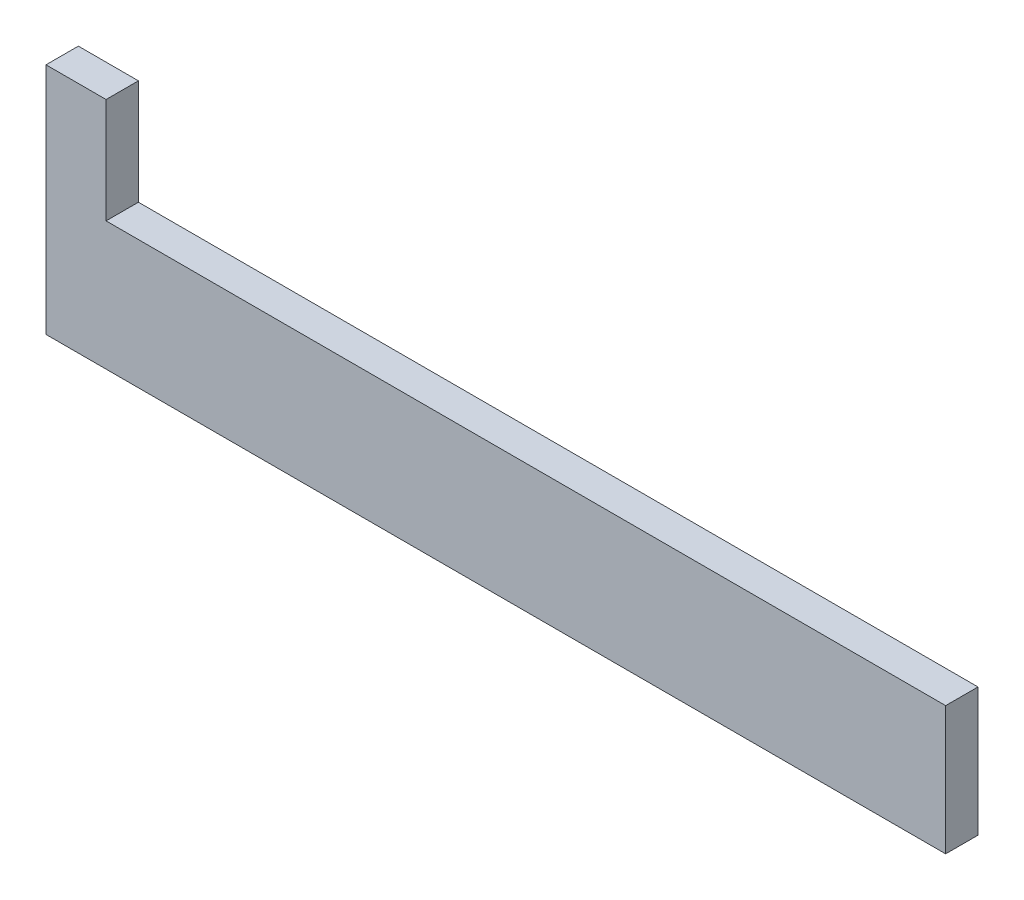
ISO-10303-21;
HEADER;
FILE_DESCRIPTION(('STEP AP214'),'2;1');
FILE_NAME('part.step','',(''),(''),'','','');
FILE_SCHEMA(('AUTOMOTIVE_DESIGN { 1 0 10303 214 1 1 1 1 }'));
ENDSEC;
DATA;
#1=APPLICATION_CONTEXT('core data for automotive mechanical design processes');
#2=APPLICATION_PROTOCOL_DEFINITION('international standard','automotive_design',2000,#1);
#3=PRODUCT_CONTEXT('',#1,'mechanical');
#4=PRODUCT('Part','Part','',(#3));
#5=PRODUCT_RELATED_PRODUCT_CATEGORY('part','',(#4));
#6=PRODUCT_DEFINITION_FORMATION('','',#4);
#7=PRODUCT_DEFINITION_CONTEXT('part definition',#1,'design');
#8=PRODUCT_DEFINITION('design','',#6,#7);
#9=PRODUCT_DEFINITION_SHAPE('','',#8);
#10=(LENGTH_UNIT() NAMED_UNIT(*) SI_UNIT(.MILLI.,.METRE.));
#11=(NAMED_UNIT(*) PLANE_ANGLE_UNIT() SI_UNIT($,.RADIAN.));
#12=(NAMED_UNIT(*) SI_UNIT($,.STERADIAN.) SOLID_ANGLE_UNIT());
#13=UNCERTAINTY_MEASURE_WITH_UNIT(LENGTH_MEASURE(1.E-05),#10,'distance_accuracy_value','');
#14=(GEOMETRIC_REPRESENTATION_CONTEXT(3) GLOBAL_UNCERTAINTY_ASSIGNED_CONTEXT((#13)) GLOBAL_UNIT_ASSIGNED_CONTEXT((#10,
#11,#12)) REPRESENTATION_CONTEXT('',''));
#15=CARTESIAN_POINT('',(0.,0.,0.));
#16=DIRECTION('',(0.,0.,1.));
#17=DIRECTION('',(1.,0.,0.));
#18=AXIS2_PLACEMENT_3D('',#15,#16,#17);
#19=CARTESIAN_POINT('',(24.,8.5489795,2.1536931));
#20=DIRECTION('',(0.,-1.,0.));
#21=DIRECTION('',(0.,0.,-1.));
#22=AXIS2_PLACEMENT_3D('',#19,#20,#21);
#23=PLANE('',#22);
#24=DIRECTION('',(-1.,0.,0.));
#25=VECTOR('',#24,1.);
#26=CARTESIAN_POINT('',(24.,8.5489795,0.));
#27=LINE('',#26,#25);
#28=CARTESIAN_POINT('',(31.9,8.5489795,0.));
#29=VERTEX_POINT('',#28);
#30=CARTESIAN_POINT('',(-24.,8.5489795,0.));
#31=VERTEX_POINT('',#30);
#32=EDGE_CURVE('E96',#29,#31,#27,.T.);
#33=ORIENTED_EDGE('',*,*,#32,.T.);
#34=DIRECTION('',(0.,0.,-1.));
#35=VECTOR('',#34,1.);
#36=CARTESIAN_POINT('',(-24.,8.5489795,2.1536931));
#37=LINE('',#36,#35);
#38=CARTESIAN_POINT('',(-24.,8.5489795,2.1536931));
#39=VERTEX_POINT('',#38);
#40=EDGE_CURVE('E11',#39,#31,#37,.T.);
#41=ORIENTED_EDGE('',*,*,#40,.F.);
#42=DIRECTION('',(-1.,0.,0.));
#43=VECTOR('',#42,1.);
#44=CARTESIAN_POINT('',(24.,8.5489795,2.1536931));
#45=LINE('',#44,#43);
#46=CARTESIAN_POINT('',(31.9,8.5489795,2.1536931));
#47=VERTEX_POINT('',#46);
#48=EDGE_CURVE('E82',#47,#39,#45,.T.);
#49=ORIENTED_EDGE('',*,*,#48,.F.);
#50=DIRECTION('',(0.,0.,1.));
#51=VECTOR('',#50,1.);
#52=CARTESIAN_POINT('',(31.9,8.5489795,0.));
#53=LINE('',#52,#51);
#54=EDGE_CURVE('E107',#29,#47,#53,.T.);
#55=ORIENTED_EDGE('',*,*,#54,.F.);
#56=EDGE_LOOP('',(#33,#41,#49,#55));
#57=FACE_BOUND('',#56,.T.);
#58=ADVANCED_FACE('F35',(#57),#23,.F.);
#59=CARTESIAN_POINT('',(-24.,15.5489795,2.1536931));
#60=DIRECTION('',(-1.,0.,0.));
#61=DIRECTION('',(0.,0.,1.));
#62=AXIS2_PLACEMENT_3D('',#59,#60,#61);
#63=PLANE('',#62);
#64=DIRECTION('',(0.,1.,0.));
#65=VECTOR('',#64,1.);
#66=CARTESIAN_POINT('',(-24.,15.5489795,0.));
#67=LINE('',#66,#65);
#68=CARTESIAN_POINT('',(-24.,15.5489795,0.));
#69=VERTEX_POINT('',#68);
#70=EDGE_CURVE('E102',#31,#69,#67,.T.);
#71=ORIENTED_EDGE('',*,*,#70,.T.);
#72=DIRECTION('',(0.,0.,-1.));
#73=VECTOR('',#72,1.);
#74=CARTESIAN_POINT('',(-24.,15.5489795,2.1536931));
#75=LINE('',#74,#73);
#76=CARTESIAN_POINT('',(-24.,15.5489795,2.1536931));
#77=VERTEX_POINT('',#76);
#78=EDGE_CURVE('E43',#77,#69,#75,.T.);
#79=ORIENTED_EDGE('',*,*,#78,.F.);
#80=DIRECTION('',(0.,1.,0.));
#81=VECTOR('',#80,1.);
#82=CARTESIAN_POINT('',(-24.,15.5489795,2.1536931));
#83=LINE('',#82,#81);
#84=EDGE_CURVE('E120',#39,#77,#83,.T.);
#85=ORIENTED_EDGE('',*,*,#84,.F.);
#86=ORIENTED_EDGE('',*,*,#40,.T.);
#87=EDGE_LOOP('',(#71,#79,#85,#86));
#88=FACE_BOUND('',#87,.T.);
#89=ADVANCED_FACE('F153',(#88),#63,.F.);
#90=CARTESIAN_POINT('',(-28.,15.5489795,2.1536931));
#91=DIRECTION('',(0.,-1.,0.));
#92=DIRECTION('',(0.,0.,-1.));
#93=AXIS2_PLACEMENT_3D('',#90,#91,#92);
#94=PLANE('',#93);
#95=DIRECTION('',(-1.,0.,0.));
#96=VECTOR('',#95,1.);
#97=CARTESIAN_POINT('',(-28.,15.5489795,0.));
#98=LINE('',#97,#96);
#99=CARTESIAN_POINT('',(-28.,15.5489795,0.));
#100=VERTEX_POINT('',#99);
#101=EDGE_CURVE('E69',#69,#100,#98,.T.);
#102=ORIENTED_EDGE('',*,*,#101,.T.);
#103=DIRECTION('',(0.,0.,-1.));
#104=VECTOR('',#103,1.);
#105=CARTESIAN_POINT('',(-28.,15.5489795,2.1536931));
#106=LINE('',#105,#104);
#107=CARTESIAN_POINT('',(-28.,15.5489795,2.1536931));
#108=VERTEX_POINT('',#107);
#109=EDGE_CURVE('E134',#108,#100,#106,.T.);
#110=ORIENTED_EDGE('',*,*,#109,.F.);
#111=DIRECTION('',(-1.,0.,0.));
#112=VECTOR('',#111,1.);
#113=CARTESIAN_POINT('',(-28.,15.5489795,2.1536931));
#114=LINE('',#113,#112);
#115=EDGE_CURVE('E123',#77,#108,#114,.T.);
#116=ORIENTED_EDGE('',*,*,#115,.F.);
#117=ORIENTED_EDGE('',*,*,#78,.T.);
#118=EDGE_LOOP('',(#102,#110,#116,#117));
#119=FACE_BOUND('',#118,.T.);
#120=ADVANCED_FACE('F137',(#119),#94,.F.);
#121=CARTESIAN_POINT('',(-28.,0.,2.1536931));
#122=DIRECTION('',(1.,0.,0.));
#123=DIRECTION('',(0.,0.,-1.));
#124=AXIS2_PLACEMENT_3D('',#121,#122,#123);
#125=PLANE('',#124);
#126=DIRECTION('',(0.,-1.,0.));
#127=VECTOR('',#126,1.);
#128=CARTESIAN_POINT('',(-28.,0.,0.));
#129=LINE('',#128,#127);
#130=CARTESIAN_POINT('',(-28.,0.,0.));
#131=VERTEX_POINT('',#130);
#132=EDGE_CURVE('E75',#100,#131,#129,.T.);
#133=ORIENTED_EDGE('',*,*,#132,.T.);
#134=DIRECTION('',(0.,0.,-1.));
#135=VECTOR('',#134,1.);
#136=CARTESIAN_POINT('',(-28.,0.,2.1536931));
#137=LINE('',#136,#135);
#138=CARTESIAN_POINT('',(-28.,0.,2.1536931));
#139=VERTEX_POINT('',#138);
#140=EDGE_CURVE('E127',#139,#131,#137,.T.);
#141=ORIENTED_EDGE('',*,*,#140,.F.);
#142=DIRECTION('',(0.,-1.,0.));
#143=VECTOR('',#142,1.);
#144=CARTESIAN_POINT('',(-28.,0.,2.1536931));
#145=LINE('',#144,#143);
#146=EDGE_CURVE('E51',#108,#139,#145,.T.);
#147=ORIENTED_EDGE('',*,*,#146,.F.);
#148=ORIENTED_EDGE('',*,*,#109,.T.);
#149=EDGE_LOOP('',(#133,#141,#147,#148));
#150=FACE_BOUND('',#149,.T.);
#151=ADVANCED_FACE('F143',(#150),#125,.F.);
#152=CARTESIAN_POINT('',(28.,0.,2.1536931));
#153=DIRECTION('',(0.,1.,0.));
#154=DIRECTION('',(0.,0.,1.));
#155=AXIS2_PLACEMENT_3D('',#152,#153,#154);
#156=PLANE('',#155);
#157=DIRECTION('',(1.,0.,0.));
#158=VECTOR('',#157,1.);
#159=CARTESIAN_POINT('',(28.,0.,0.));
#160=LINE('',#159,#158);
#161=CARTESIAN_POINT('',(31.9,0.,0.));
#162=VERTEX_POINT('',#161);
#163=EDGE_CURVE('E121',#131,#162,#160,.T.);
#164=ORIENTED_EDGE('',*,*,#163,.T.);
#165=DIRECTION('',(0.,0.,-1.));
#166=VECTOR('',#165,1.);
#167=CARTESIAN_POINT('',(31.9,0.,0.));
#168=LINE('',#167,#166);
#169=CARTESIAN_POINT('',(31.9,0.,2.1536931));
#170=VERTEX_POINT('',#169);
#171=EDGE_CURVE('E104',#170,#162,#168,.T.);
#172=ORIENTED_EDGE('',*,*,#171,.F.);
#173=DIRECTION('',(1.,0.,0.));
#174=VECTOR('',#173,1.);
#175=CARTESIAN_POINT('',(28.,0.,2.1536931));
#176=LINE('',#175,#174);
#177=EDGE_CURVE('E126',#139,#170,#176,.T.);
#178=ORIENTED_EDGE('',*,*,#177,.F.);
#179=ORIENTED_EDGE('',*,*,#140,.T.);
#180=EDGE_LOOP('',(#164,#172,#178,#179));
#181=FACE_BOUND('',#180,.T.);
#182=ADVANCED_FACE('F141',(#181),#156,.F.);
#183=CARTESIAN_POINT('',(0.,0.,2.1536931));
#184=DIRECTION('',(0.,0.,1.));
#185=DIRECTION('',(1.,0.,0.));
#186=AXIS2_PLACEMENT_3D('',#183,#184,#185);
#187=PLANE('',#186);
#188=ORIENTED_EDGE('',*,*,#177,.T.);
#189=DIRECTION('',(0.,-1.,0.));
#190=VECTOR('',#189,1.);
#191=CARTESIAN_POINT('',(31.9,8.5489795,2.1536931));
#192=LINE('',#191,#190);
#193=EDGE_CURVE('E110',#47,#170,#192,.T.);
#194=ORIENTED_EDGE('',*,*,#193,.F.);
#195=ORIENTED_EDGE('',*,*,#48,.T.);
#196=ORIENTED_EDGE('',*,*,#84,.T.);
#197=ORIENTED_EDGE('',*,*,#115,.T.);
#198=ORIENTED_EDGE('',*,*,#146,.T.);
#199=EDGE_LOOP('',(#188,#194,#195,#196,#197,#198));
#200=FACE_BOUND('',#199,.T.);
#201=ADVANCED_FACE('F151',(#200),#187,.T.);
#202=CARTESIAN_POINT('',(0.,0.,0.));
#203=DIRECTION('',(0.,0.,1.));
#204=DIRECTION('',(1.,0.,0.));
#205=AXIS2_PLACEMENT_3D('',#202,#203,#204);
#206=PLANE('',#205);
#207=ORIENTED_EDGE('',*,*,#32,.F.);
#208=DIRECTION('',(0.,1.,0.));
#209=VECTOR('',#208,1.);
#210=CARTESIAN_POINT('',(31.9,8.5489795,0.));
#211=LINE('',#210,#209);
#212=EDGE_CURVE('E101',#162,#29,#211,.T.);
#213=ORIENTED_EDGE('',*,*,#212,.F.);
#214=ORIENTED_EDGE('',*,*,#163,.F.);
#215=ORIENTED_EDGE('',*,*,#132,.F.);
#216=ORIENTED_EDGE('',*,*,#101,.F.);
#217=ORIENTED_EDGE('',*,*,#70,.F.);
#218=EDGE_LOOP('',(#207,#213,#214,#215,#216,#217));
#219=FACE_BOUND('',#218,.T.);
#220=ADVANCED_FACE('F98',(#219),#206,.F.);
#221=CARTESIAN_POINT('',(31.9,0.,0.));
#222=DIRECTION('',(-1.,0.,0.));
#223=DIRECTION('',(0.,0.,1.));
#224=AXIS2_PLACEMENT_3D('',#221,#222,#223);
#225=PLANE('',#224);
#226=ORIENTED_EDGE('',*,*,#212,.T.);
#227=ORIENTED_EDGE('',*,*,#54,.T.);
#228=ORIENTED_EDGE('',*,*,#193,.T.);
#229=ORIENTED_EDGE('',*,*,#171,.T.);
#230=EDGE_LOOP('',(#226,#227,#228,#229));
#231=FACE_BOUND('',#230,.T.);
#232=ADVANCED_FACE('F113',(#231),#225,.F.);
#233=CLOSED_SHELL('',(#58,#89,#120,#151,#182,#201,#220,#232));
#234=MANIFOLD_SOLID_BREP('B2',#233);
#235=ADVANCED_BREP_SHAPE_REPRESENTATION('',(#18,#234),#14);
#236=SHAPE_DEFINITION_REPRESENTATION(#9,#235);
ENDSEC;
END-ISO-10303-21;
